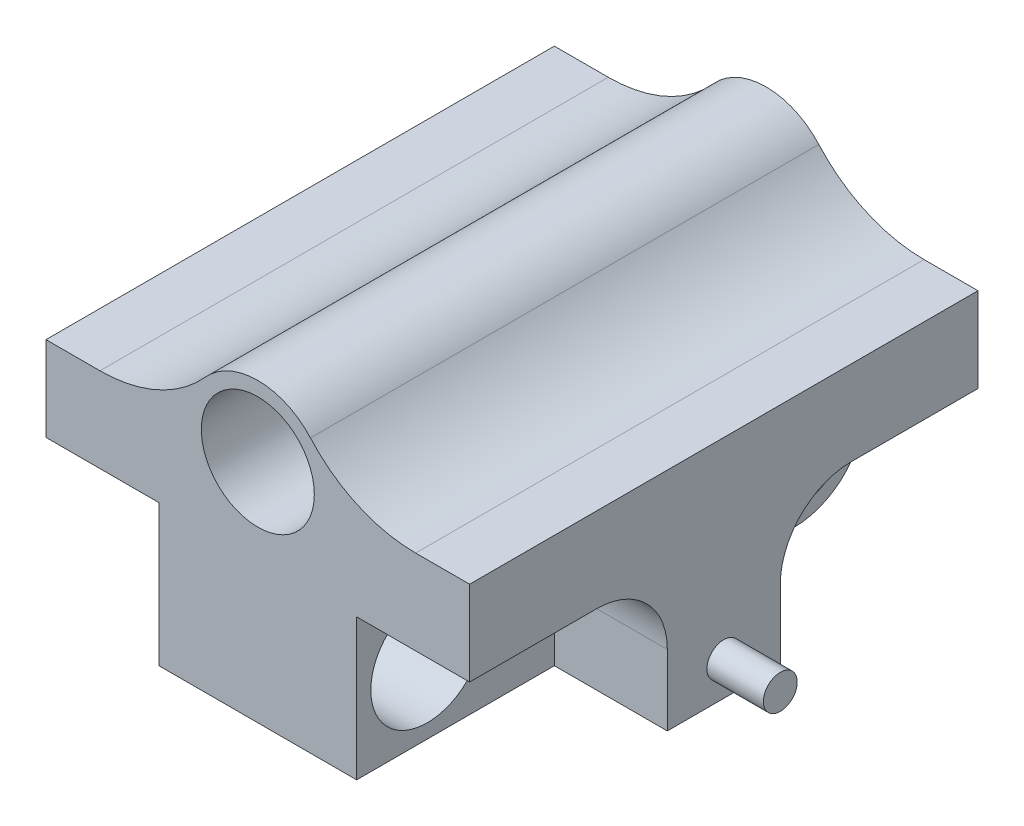
ISO-10303-21;
HEADER;
FILE_DESCRIPTION(('STEP AP214'),'2;1');
FILE_NAME('part.step','',(''),(''),'','','');
FILE_SCHEMA(('AUTOMOTIVE_DESIGN { 1 0 10303 214 1 1 1 1 }'));
ENDSEC;
DATA;
#1=APPLICATION_CONTEXT('core data for automotive mechanical design processes');
#2=APPLICATION_PROTOCOL_DEFINITION('international standard','automotive_design',2000,#1);
#3=PRODUCT_CONTEXT('',#1,'mechanical');
#4=PRODUCT('Part','Part','',(#3));
#5=PRODUCT_RELATED_PRODUCT_CATEGORY('part','',(#4));
#6=PRODUCT_DEFINITION_FORMATION('','',#4);
#7=PRODUCT_DEFINITION_CONTEXT('part definition',#1,'design');
#8=PRODUCT_DEFINITION('design','',#6,#7);
#9=PRODUCT_DEFINITION_SHAPE('','',#8);
#10=(LENGTH_UNIT() NAMED_UNIT(*) SI_UNIT(.MILLI.,.METRE.));
#11=(NAMED_UNIT(*) PLANE_ANGLE_UNIT() SI_UNIT($,.RADIAN.));
#12=(NAMED_UNIT(*) SI_UNIT($,.STERADIAN.) SOLID_ANGLE_UNIT());
#13=UNCERTAINTY_MEASURE_WITH_UNIT(LENGTH_MEASURE(1.E-05),#10,'distance_accuracy_value','');
#14=(GEOMETRIC_REPRESENTATION_CONTEXT(3) GLOBAL_UNCERTAINTY_ASSIGNED_CONTEXT((#13)) GLOBAL_UNIT_ASSIGNED_CONTEXT((#10,
#11,#12)) REPRESENTATION_CONTEXT('',''));
#15=CARTESIAN_POINT('',(0.,0.,0.));
#16=DIRECTION('',(0.,0.,1.));
#17=DIRECTION('',(1.,0.,0.));
#18=AXIS2_PLACEMENT_3D('',#15,#16,#17);
#19=CARTESIAN_POINT('',(95.0000000000002,-68.,-90.));
#20=DIRECTION('',(1.,0.,0.));
#21=DIRECTION('',(0.,0.,-1.));
#22=AXIS2_PLACEMENT_3D('',#19,#20,#21);
#23=PLANE('',#22);
#24=CARTESIAN_POINT('',(95.0000000000002,-68.,-90.));
#25=DIRECTION('',(-1.,0.,0.));
#26=DIRECTION('',(0.,-1.,0.));
#27=AXIS2_PLACEMENT_3D('',#24,#25,#26);
#28=CIRCLE('',#27,6.);
#29=CARTESIAN_POINT('',(95.0000000000002,-74.,-90.));
#30=VERTEX_POINT('',#29);
#31=EDGE_CURVE('E20',#30,#30,#28,.T.);
#32=ORIENTED_EDGE('',*,*,#31,.F.);
#33=EDGE_LOOP('',(#32));
#34=FACE_BOUND('',#33,.T.);
#35=ADVANCED_FACE('F17',(#34),#23,.T.);
#36=CARTESIAN_POINT('',(-94.9999999999999,-68.0000000000001,-90.));
#37=DIRECTION('',(1.,0.,0.));
#38=DIRECTION('',(0.,0.,-1.));
#39=AXIS2_PLACEMENT_3D('',#36,#37,#38);
#40=PLANE('',#39);
#41=CARTESIAN_POINT('',(-94.9999999999999,-68.0000000000001,-90.));
#42=DIRECTION('',(1.,0.,0.));
#43=DIRECTION('',(0.,1.,0.));
#44=AXIS2_PLACEMENT_3D('',#41,#42,#43);
#45=CIRCLE('',#44,6.);
#46=CARTESIAN_POINT('',(-94.9999999999999,-62.0000000000001,-90.));
#47=VERTEX_POINT('',#46);
#48=EDGE_CURVE('E211',#47,#47,#45,.T.);
#49=ORIENTED_EDGE('',*,*,#48,.F.);
#50=EDGE_LOOP('',(#49));
#51=FACE_BOUND('',#50,.T.);
#52=ADVANCED_FACE('F806',(#51),#40,.F.);
#53=CARTESIAN_POINT('',(-221.758641529355,-55.0000000000002,-25.));
#54=DIRECTION('',(1.,0.,0.));
#55=DIRECTION('',(0.,1.,0.));
#56=AXIS2_PLACEMENT_3D('',#53,#54,#55);
#57=CYLINDRICAL_SURFACE('',#56,20.);
#58=CARTESIAN_POINT('',(35.0000000000002,-55.,-25.));
#59=DIRECTION('',(1.,0.,0.));
#60=DIRECTION('',(0.,1.,0.));
#61=AXIS2_PLACEMENT_3D('',#58,#59,#60);
#62=CIRCLE('',#61,20.);
#63=CARTESIAN_POINT('',(35.0000000000001,-35.,-25.));
#64=VERTEX_POINT('',#63);
#65=EDGE_CURVE('E256',#64,#64,#62,.F.);
#66=ORIENTED_EDGE('',*,*,#65,.F.);
#67=EDGE_LOOP('',(#66));
#68=FACE_BOUND('',#67,.T.);
#69=CARTESIAN_POINT('',(-35.0000000000002,-55.0000000000001,-25.));
#70=DIRECTION('',(1.,0.,0.));
#71=DIRECTION('',(0.,1.,0.));
#72=AXIS2_PLACEMENT_3D('',#69,#70,#71);
#73=CIRCLE('',#72,20.);
#74=CARTESIAN_POINT('',(-35.0000000000002,-35.0000000000001,-25.));
#75=VERTEX_POINT('',#74);
#76=EDGE_CURVE('E204',#75,#75,#73,.F.);
#77=ORIENTED_EDGE('',*,*,#76,.T.);
#78=EDGE_LOOP('',(#77));
#79=FACE_BOUND('',#78,.T.);
#80=ADVANCED_FACE('F798',(#68,#79),#57,.F.);
#81=CARTESIAN_POINT('',(-221.758641529355,-55.0000000000002,-155.));
#82=DIRECTION('',(-1.,0.,0.));
#83=DIRECTION('',(0.,-1.,0.));
#84=AXIS2_PLACEMENT_3D('',#81,#82,#83);
#85=CYLINDRICAL_SURFACE('',#84,20.);
#86=CARTESIAN_POINT('',(35.0000000000002,-55.,-155.));
#87=DIRECTION('',(-1.,0.,0.));
#88=DIRECTION('',(0.,-1.,0.));
#89=AXIS2_PLACEMENT_3D('',#86,#87,#88);
#90=CIRCLE('',#89,20.);
#91=CARTESIAN_POINT('',(35.0000000000002,-75.,-155.));
#92=VERTEX_POINT('',#91);
#93=EDGE_CURVE('E251',#92,#92,#90,.F.);
#94=ORIENTED_EDGE('',*,*,#93,.T.);
#95=EDGE_LOOP('',(#94));
#96=FACE_BOUND('',#95,.T.);
#97=CARTESIAN_POINT('',(-35.0000000000002,-55.0000000000001,-155.));
#98=DIRECTION('',(-1.,0.,0.));
#99=DIRECTION('',(0.,-1.,0.));
#100=AXIS2_PLACEMENT_3D('',#97,#98,#99);
#101=CIRCLE('',#100,20.);
#102=CARTESIAN_POINT('',(-35.0000000000002,-75.0000000000001,-155.));
#103=VERTEX_POINT('',#102);
#104=EDGE_CURVE('E319',#103,#103,#101,.F.);
#105=ORIENTED_EDGE('',*,*,#104,.F.);
#106=EDGE_LOOP('',(#105));
#107=FACE_BOUND('',#106,.T.);
#108=ADVANCED_FACE('F791',(#96,#107),#85,.F.);
#109=CARTESIAN_POINT('',(75.0000000000002,-55.,-45.));
#110=DIRECTION('',(-1.,0.,0.));
#111=DIRECTION('',(0.,-1.,0.));
#112=AXIS2_PLACEMENT_3D('',#109,#110,#111);
#113=CYLINDRICAL_SURFACE('',#112,25.);
#114=DIRECTION('',(1.,0.,0.));
#115=VECTOR('',#114,1.);
#116=CARTESIAN_POINT('',(75.0000000000001,-30.,-45.));
#117=LINE('',#116,#115);
#118=CARTESIAN_POINT('',(75.0000000000001,-30.,-45.));
#119=VERTEX_POINT('',#118);
#120=CARTESIAN_POINT('',(35.0000000000001,-30.,-45.));
#121=VERTEX_POINT('',#120);
#122=EDGE_CURVE('E252',#119,#121,#117,.F.);
#123=ORIENTED_EDGE('',*,*,#122,.T.);
#124=CARTESIAN_POINT('',(35.0000000000001,-55.,-45.));
#125=DIRECTION('',(-1.,0.,0.));
#126=DIRECTION('',(0.,-1.,0.));
#127=AXIS2_PLACEMENT_3D('',#124,#125,#126);
#128=CIRCLE('',#127,25.);
#129=CARTESIAN_POINT('',(35.0000000000002,-55.,-70.));
#130=VERTEX_POINT('',#129);
#131=EDGE_CURVE('E326',#130,#121,#128,.F.);
#132=ORIENTED_EDGE('',*,*,#131,.F.);
#133=DIRECTION('',(-1.,0.,0.));
#134=VECTOR('',#133,1.);
#135=CARTESIAN_POINT('',(75.0000000000002,-55.,-70.));
#136=LINE('',#135,#134);
#137=CARTESIAN_POINT('',(75.0000000000002,-55.,-70.));
#138=VERTEX_POINT('',#137);
#139=EDGE_CURVE('E222',#130,#138,#136,.F.);
#140=ORIENTED_EDGE('',*,*,#139,.T.);
#141=CARTESIAN_POINT('',(75.0000000000002,-55.,-45.));
#142=DIRECTION('',(-1.,0.,0.));
#143=DIRECTION('',(0.,-1.,0.));
#144=AXIS2_PLACEMENT_3D('',#141,#142,#143);
#145=CIRCLE('',#144,25.);
#146=EDGE_CURVE('E305',#138,#119,#145,.F.);
#147=ORIENTED_EDGE('',*,*,#146,.T.);
#148=EDGE_LOOP('',(#123,#132,#140,#147));
#149=FACE_BOUND('',#148,.T.);
#150=ADVANCED_FACE('F561',(#149),#113,.F.);
#151=CARTESIAN_POINT('',(75.0000000000002,-55.,-135.));
#152=DIRECTION('',(1.,0.,0.));
#153=DIRECTION('',(0.,1.,0.));
#154=AXIS2_PLACEMENT_3D('',#151,#152,#153);
#155=CYLINDRICAL_SURFACE('',#154,25.);
#156=DIRECTION('',(-1.,0.,0.));
#157=VECTOR('',#156,1.);
#158=CARTESIAN_POINT('',(75.0000000000002,-55.,-110.));
#159=LINE('',#158,#157);
#160=CARTESIAN_POINT('',(35.0000000000002,-55.,-110.));
#161=VERTEX_POINT('',#160);
#162=CARTESIAN_POINT('',(75.0000000000002,-55.,-110.));
#163=VERTEX_POINT('',#162);
#164=EDGE_CURVE('E229',#161,#163,#159,.F.);
#165=ORIENTED_EDGE('',*,*,#164,.F.);
#166=CARTESIAN_POINT('',(35.0000000000002,-55.,-135.));
#167=DIRECTION('',(1.,0.,0.));
#168=DIRECTION('',(0.,1.,0.));
#169=AXIS2_PLACEMENT_3D('',#166,#167,#168);
#170=CIRCLE('',#169,25.);
#171=CARTESIAN_POINT('',(35.0000000000001,-30.,-135.));
#172=VERTEX_POINT('',#171);
#173=EDGE_CURVE('E314',#161,#172,#170,.F.);
#174=ORIENTED_EDGE('',*,*,#173,.T.);
#175=DIRECTION('',(1.,0.,0.));
#176=VECTOR('',#175,1.);
#177=CARTESIAN_POINT('',(75.0000000000001,-30.,-135.));
#178=LINE('',#177,#176);
#179=CARTESIAN_POINT('',(75.0000000000001,-30.,-135.));
#180=VERTEX_POINT('',#179);
#181=EDGE_CURVE('E248',#180,#172,#178,.F.);
#182=ORIENTED_EDGE('',*,*,#181,.F.);
#183=CARTESIAN_POINT('',(75.0000000000002,-55.,-135.));
#184=DIRECTION('',(1.,0.,0.));
#185=DIRECTION('',(0.,1.,0.));
#186=AXIS2_PLACEMENT_3D('',#183,#184,#185);
#187=CIRCLE('',#186,25.);
#188=EDGE_CURVE('E301',#180,#163,#187,.T.);
#189=ORIENTED_EDGE('',*,*,#188,.T.);
#190=EDGE_LOOP('',(#165,#174,#182,#189));
#191=FACE_BOUND('',#190,.T.);
#192=ADVANCED_FACE('F572',(#191),#155,.F.);
#193=CARTESIAN_POINT('',(75.0000000000002,-55.,-110.));
#194=DIRECTION('',(0.,0.,-1.));
#195=DIRECTION('',(-1.,0.,0.));
#196=AXIS2_PLACEMENT_3D('',#193,#194,#195);
#197=PLANE('',#196);
#198=DIRECTION('',(0.,1.,0.));
#199=VECTOR('',#198,1.);
#200=CARTESIAN_POINT('',(35.0000000000002,-57.1359971060513,-110.));
#201=LINE('',#200,#199);
#202=CARTESIAN_POINT('',(35.0000000000002,-80.,-110.));
#203=VERTEX_POINT('',#202);
#204=EDGE_CURVE('E317',#203,#161,#201,.T.);
#205=ORIENTED_EDGE('',*,*,#204,.T.);
#206=ORIENTED_EDGE('',*,*,#164,.T.);
#207=DIRECTION('',(0.,1.,0.));
#208=VECTOR('',#207,1.);
#209=CARTESIAN_POINT('',(75.0000000000001,0.,-110.));
#210=LINE('',#209,#208);
#211=CARTESIAN_POINT('',(75.0000000000001,-80.,-110.));
#212=VERTEX_POINT('',#211);
#213=EDGE_CURVE('E234',#163,#212,#210,.F.);
#214=ORIENTED_EDGE('',*,*,#213,.T.);
#215=DIRECTION('',(1.,0.,0.));
#216=VECTOR('',#215,1.);
#217=CARTESIAN_POINT('',(75.0000000000002,-80.,-110.));
#218=LINE('',#217,#216);
#219=EDGE_CURVE('E239',#212,#203,#218,.F.);
#220=ORIENTED_EDGE('',*,*,#219,.T.);
#221=EDGE_LOOP('',(#205,#206,#214,#220));
#222=FACE_BOUND('',#221,.T.);
#223=ADVANCED_FACE('F566',(#222),#197,.T.);
#224=CARTESIAN_POINT('',(75.0000000000002,-55.,-70.));
#225=DIRECTION('',(0.,0.,-1.));
#226=DIRECTION('',(-1.,0.,0.));
#227=AXIS2_PLACEMENT_3D('',#224,#225,#226);
#228=PLANE('',#227);
#229=ORIENTED_EDGE('',*,*,#139,.F.);
#230=DIRECTION('',(0.,1.,0.));
#231=VECTOR('',#230,1.);
#232=CARTESIAN_POINT('',(35.0000000000002,-57.1359971060513,-70.));
#233=LINE('',#232,#231);
#234=CARTESIAN_POINT('',(35.0000000000002,-80.,-70.));
#235=VERTEX_POINT('',#234);
#236=EDGE_CURVE('E327',#235,#130,#233,.T.);
#237=ORIENTED_EDGE('',*,*,#236,.F.);
#238=DIRECTION('',(1.,0.,0.));
#239=VECTOR('',#238,1.);
#240=CARTESIAN_POINT('',(75.0000000000002,-80.,-70.));
#241=LINE('',#240,#239);
#242=CARTESIAN_POINT('',(75.0000000000001,-80.,-70.));
#243=VERTEX_POINT('',#242);
#244=EDGE_CURVE('E237',#235,#243,#241,.T.);
#245=ORIENTED_EDGE('',*,*,#244,.T.);
#246=DIRECTION('',(0.,1.,0.));
#247=VECTOR('',#246,1.);
#248=CARTESIAN_POINT('',(75.0000000000001,0.,-70.));
#249=LINE('',#248,#247);
#250=EDGE_CURVE('E233',#243,#138,#249,.T.);
#251=ORIENTED_EDGE('',*,*,#250,.T.);
#252=EDGE_LOOP('',(#229,#237,#245,#251));
#253=FACE_BOUND('',#252,.T.);
#254=ADVANCED_FACE('F558',(#253),#228,.F.);
#255=CARTESIAN_POINT('',(75.0000000000002,-68.,-90.));
#256=DIRECTION('',(-1.,0.,0.));
#257=DIRECTION('',(0.,-1.,0.));
#258=AXIS2_PLACEMENT_3D('',#255,#256,#257);
#259=CYLINDRICAL_SURFACE('',#258,6.);
#260=CARTESIAN_POINT('',(75.0000000000002,-68.,-90.));
#261=DIRECTION('',(-1.,0.,0.));
#262=DIRECTION('',(0.,-1.,0.));
#263=AXIS2_PLACEMENT_3D('',#260,#261,#262);
#264=CIRCLE('',#263,6.);
#265=CARTESIAN_POINT('',(75.0000000000002,-74.,-90.));
#266=VERTEX_POINT('',#265);
#267=EDGE_CURVE('E297',#266,#266,#264,.F.);
#268=ORIENTED_EDGE('',*,*,#267,.T.);
#269=EDGE_LOOP('',(#268));
#270=FACE_BOUND('',#269,.T.);
#271=ORIENTED_EDGE('',*,*,#31,.T.);
#272=EDGE_LOOP('',(#271));
#273=FACE_BOUND('',#272,.T.);
#274=ADVANCED_FACE('F759',(#270,#273),#259,.T.);
#275=CARTESIAN_POINT('',(-75.0000000000002,-55.,-45.));
#276=DIRECTION('',(-1.,0.,0.));
#277=DIRECTION('',(0.,-1.,0.));
#278=AXIS2_PLACEMENT_3D('',#275,#276,#277);
#279=CYLINDRICAL_SURFACE('',#278,25.);
#280=DIRECTION('',(1.,0.,0.));
#281=VECTOR('',#280,1.);
#282=CARTESIAN_POINT('',(-75.0000000000002,-55.,-70.));
#283=LINE('',#282,#281);
#284=CARTESIAN_POINT('',(-35.0000000000002,-55.,-70.));
#285=VERTEX_POINT('',#284);
#286=CARTESIAN_POINT('',(-75.,-55.,-70.));
#287=VERTEX_POINT('',#286);
#288=EDGE_CURVE('E181',#285,#287,#283,.F.);
#289=ORIENTED_EDGE('',*,*,#288,.F.);
#290=CARTESIAN_POINT('',(-35.0000000000002,-55.,-45.));
#291=DIRECTION('',(-1.,0.,0.));
#292=DIRECTION('',(0.,-1.,0.));
#293=AXIS2_PLACEMENT_3D('',#290,#291,#292);
#294=CIRCLE('',#293,25.);
#295=CARTESIAN_POINT('',(-35.0000000000002,-30.,-45.));
#296=VERTEX_POINT('',#295);
#297=EDGE_CURVE('E200',#285,#296,#294,.F.);
#298=ORIENTED_EDGE('',*,*,#297,.T.);
#299=DIRECTION('',(1.,0.,0.));
#300=VECTOR('',#299,1.);
#301=CARTESIAN_POINT('',(-75.0000000000001,-30.,-45.));
#302=LINE('',#301,#300);
#303=CARTESIAN_POINT('',(-75.,-30.,-45.));
#304=VERTEX_POINT('',#303);
#305=EDGE_CURVE('E188',#304,#296,#302,.T.);
#306=ORIENTED_EDGE('',*,*,#305,.F.);
#307=CARTESIAN_POINT('',(-75.0000000000002,-55.,-45.));
#308=DIRECTION('',(-1.,0.,0.));
#309=DIRECTION('',(0.,-1.,0.));
#310=AXIS2_PLACEMENT_3D('',#307,#308,#309);
#311=CIRCLE('',#310,25.);
#312=EDGE_CURVE('E293',#304,#287,#311,.T.);
#313=ORIENTED_EDGE('',*,*,#312,.T.);
#314=EDGE_LOOP('',(#289,#298,#306,#313));
#315=FACE_BOUND('',#314,.T.);
#316=ADVANCED_FACE('F206',(#315),#279,.F.);
#317=CARTESIAN_POINT('',(-75.0000000000002,-55.,-70.));
#318=DIRECTION('',(0.,0.,1.));
#319=DIRECTION('',(1.,0.,0.));
#320=AXIS2_PLACEMENT_3D('',#317,#318,#319);
#321=PLANE('',#320);
#322=DIRECTION('',(0.,1.,0.));
#323=VECTOR('',#322,1.);
#324=CARTESIAN_POINT('',(-35.0000000000002,-57.1359971060513,-70.));
#325=LINE('',#324,#323);
#326=CARTESIAN_POINT('',(-35.0000000000002,-80.,-70.));
#327=VERTEX_POINT('',#326);
#328=EDGE_CURVE('E195',#327,#285,#325,.T.);
#329=ORIENTED_EDGE('',*,*,#328,.T.);
#330=ORIENTED_EDGE('',*,*,#288,.T.);
#331=DIRECTION('',(0.,1.,0.));
#332=VECTOR('',#331,1.);
#333=CARTESIAN_POINT('',(-74.9999999999998,-80.,-70.));
#334=LINE('',#333,#332);
#335=CARTESIAN_POINT('',(-74.9999999999998,-80.,-70.));
#336=VERTEX_POINT('',#335);
#337=EDGE_CURVE('E295',#287,#336,#334,.F.);
#338=ORIENTED_EDGE('',*,*,#337,.T.);
#339=DIRECTION('',(1.,0.,0.));
#340=VECTOR('',#339,1.);
#341=CARTESIAN_POINT('',(75.0000000000002,-80.,-70.));
#342=LINE('',#341,#340);
#343=EDGE_CURVE('E337',#336,#327,#342,.T.);
#344=ORIENTED_EDGE('',*,*,#343,.T.);
#345=EDGE_LOOP('',(#329,#330,#338,#344));
#346=FACE_BOUND('',#345,.T.);
#347=ADVANCED_FACE('F380',(#346),#321,.T.);
#348=CARTESIAN_POINT('',(-75.0000000000002,-55.,-110.));
#349=DIRECTION('',(0.,0.,1.));
#350=DIRECTION('',(1.,0.,0.));
#351=AXIS2_PLACEMENT_3D('',#348,#349,#350);
#352=PLANE('',#351);
#353=DIRECTION('',(1.,0.,0.));
#354=VECTOR('',#353,1.);
#355=CARTESIAN_POINT('',(-75.0000000000002,-55.,-110.));
#356=LINE('',#355,#354);
#357=CARTESIAN_POINT('',(-75.,-55.,-110.));
#358=VERTEX_POINT('',#357);
#359=CARTESIAN_POINT('',(-35.0000000000001,-55.,-110.));
#360=VERTEX_POINT('',#359);
#361=EDGE_CURVE('E196',#358,#360,#356,.T.);
#362=ORIENTED_EDGE('',*,*,#361,.T.);
#363=DIRECTION('',(0.,1.,0.));
#364=VECTOR('',#363,1.);
#365=CARTESIAN_POINT('',(-35.0000000000002,-57.1359971060513,-110.));
#366=LINE('',#365,#364);
#367=CARTESIAN_POINT('',(-35.0000000000002,-80.,-110.));
#368=VERTEX_POINT('',#367);
#369=EDGE_CURVE('E324',#368,#360,#366,.T.);
#370=ORIENTED_EDGE('',*,*,#369,.F.);
#371=DIRECTION('',(1.,0.,0.));
#372=VECTOR('',#371,1.);
#373=CARTESIAN_POINT('',(75.0000000000002,-80.,-110.));
#374=LINE('',#373,#372);
#375=CARTESIAN_POINT('',(-75.,-80.,-110.));
#376=VERTEX_POINT('',#375);
#377=EDGE_CURVE('E244',#368,#376,#374,.F.);
#378=ORIENTED_EDGE('',*,*,#377,.T.);
#379=DIRECTION('',(0.,1.,0.));
#380=VECTOR('',#379,1.);
#381=CARTESIAN_POINT('',(-74.9999999999998,-80.,-110.));
#382=LINE('',#381,#380);
#383=EDGE_CURVE('E292',#376,#358,#382,.T.);
#384=ORIENTED_EDGE('',*,*,#383,.T.);
#385=EDGE_LOOP('',(#362,#370,#378,#384));
#386=FACE_BOUND('',#385,.T.);
#387=ADVANCED_FACE('F739',(#386),#352,.F.);
#388=CARTESIAN_POINT('',(-74.9999999999999,-68.,-90.));
#389=DIRECTION('',(1.,0.,0.));
#390=DIRECTION('',(0.,1.,0.));
#391=AXIS2_PLACEMENT_3D('',#388,#389,#390);
#392=CYLINDRICAL_SURFACE('',#391,6.);
#393=CARTESIAN_POINT('',(-74.9999999999999,-68.,-90.));
#394=DIRECTION('',(1.,0.,0.));
#395=DIRECTION('',(0.,1.,0.));
#396=AXIS2_PLACEMENT_3D('',#393,#394,#395);
#397=CIRCLE('',#396,6.);
#398=CARTESIAN_POINT('',(-74.9999999999999,-62.,-90.));
#399=VERTEX_POINT('',#398);
#400=EDGE_CURVE('E284',#399,#399,#397,.F.);
#401=ORIENTED_EDGE('',*,*,#400,.T.);
#402=EDGE_LOOP('',(#401));
#403=FACE_BOUND('',#402,.T.);
#404=ORIENTED_EDGE('',*,*,#48,.T.);
#405=EDGE_LOOP('',(#404));
#406=FACE_BOUND('',#405,.T.);
#407=ADVANCED_FACE('F731',(#403,#406),#392,.T.);
#408=CARTESIAN_POINT('',(-75.0000000000002,-55.,-135.));
#409=DIRECTION('',(1.,0.,0.));
#410=DIRECTION('',(0.,1.,0.));
#411=AXIS2_PLACEMENT_3D('',#408,#409,#410);
#412=CYLINDRICAL_SURFACE('',#411,25.);
#413=DIRECTION('',(1.,0.,0.));
#414=VECTOR('',#413,1.);
#415=CARTESIAN_POINT('',(-75.0000000000001,-30.,-135.));
#416=LINE('',#415,#414);
#417=CARTESIAN_POINT('',(-75.0000000000001,-30.,-135.));
#418=VERTEX_POINT('',#417);
#419=CARTESIAN_POINT('',(-35.0000000000001,-30.,-135.));
#420=VERTEX_POINT('',#419);
#421=EDGE_CURVE('E287',#418,#420,#416,.T.);
#422=ORIENTED_EDGE('',*,*,#421,.T.);
#423=CARTESIAN_POINT('',(-35.0000000000001,-55.,-135.));
#424=DIRECTION('',(1.,0.,0.));
#425=DIRECTION('',(0.,1.,0.));
#426=AXIS2_PLACEMENT_3D('',#423,#424,#425);
#427=CIRCLE('',#426,25.);
#428=EDGE_CURVE('E322',#360,#420,#427,.F.);
#429=ORIENTED_EDGE('',*,*,#428,.F.);
#430=ORIENTED_EDGE('',*,*,#361,.F.);
#431=CARTESIAN_POINT('',(-75.0000000000002,-55.,-135.));
#432=DIRECTION('',(1.,0.,0.));
#433=DIRECTION('',(0.,1.,0.));
#434=AXIS2_PLACEMENT_3D('',#431,#432,#433);
#435=CIRCLE('',#434,25.);
#436=EDGE_CURVE('E288',#358,#418,#435,.F.);
#437=ORIENTED_EDGE('',*,*,#436,.T.);
#438=EDGE_LOOP('',(#422,#429,#430,#437));
#439=FACE_BOUND('',#438,.T.);
#440=ADVANCED_FACE('F724',(#439),#412,.F.);
#441=CARTESIAN_POINT('',(-75.0000000000001,-30.,0.));
#442=DIRECTION('',(0.,-1.,0.));
#443=DIRECTION('',(0.,0.,-1.));
#444=AXIS2_PLACEMENT_3D('',#441,#442,#443);
#445=PLANE('',#444);
#446=DIRECTION('',(0.,0.,-1.));
#447=VECTOR('',#446,1.);
#448=CARTESIAN_POINT('',(-35.0000000000002,-30.,-31.9276920603419));
#449=LINE('',#448,#447);
#450=CARTESIAN_POINT('',(-35.0000000000001,-30.,0.));
#451=VERTEX_POINT('',#450);
#452=EDGE_CURVE('E192',#296,#451,#449,.F.);
#453=ORIENTED_EDGE('',*,*,#452,.T.);
#454=DIRECTION('',(1.,0.,0.));
#455=VECTOR('',#454,1.);
#456=CARTESIAN_POINT('',(0.,-30.,0.));
#457=LINE('',#456,#455);
#458=CARTESIAN_POINT('',(-75.,-30.,0.));
#459=VERTEX_POINT('',#458);
#460=EDGE_CURVE('E356',#459,#451,#457,.T.);
#461=ORIENTED_EDGE('',*,*,#460,.F.);
#462=DIRECTION('',(0.,0.,-1.));
#463=VECTOR('',#462,1.);
#464=CARTESIAN_POINT('',(-74.9999999999998,-30.,-180.));
#465=LINE('',#464,#463);
#466=EDGE_CURVE('E194',#459,#304,#465,.T.);
#467=ORIENTED_EDGE('',*,*,#466,.T.);
#468=ORIENTED_EDGE('',*,*,#305,.T.);
#469=EDGE_LOOP('',(#453,#461,#467,#468));
#470=FACE_BOUND('',#469,.T.);
#471=ADVANCED_FACE('F190',(#470),#445,.T.);
#472=CARTESIAN_POINT('',(-35.0000000000002,-57.1359971060513,-31.9276920603419));
#473=DIRECTION('',(1.,0.,0.));
#474=DIRECTION('',(0.,0.,-1.));
#475=AXIS2_PLACEMENT_3D('',#472,#473,#474);
#476=PLANE('',#475);
#477=ORIENTED_EDGE('',*,*,#76,.F.);
#478=EDGE_LOOP('',(#477));
#479=FACE_BOUND('',#478,.T.);
#480=DIRECTION('',(0.,1.,0.));
#481=VECTOR('',#480,1.);
#482=CARTESIAN_POINT('',(-35.0000000000001,0.,0.));
#483=LINE('',#482,#481);
#484=CARTESIAN_POINT('',(-35.0000000000001,-80.,0.));
#485=VERTEX_POINT('',#484);
#486=EDGE_CURVE('E203',#451,#485,#483,.F.);
#487=ORIENTED_EDGE('',*,*,#486,.F.);
#488=ORIENTED_EDGE('',*,*,#452,.F.);
#489=ORIENTED_EDGE('',*,*,#297,.F.);
#490=ORIENTED_EDGE('',*,*,#328,.F.);
#491=DIRECTION('',(0.,0.,1.));
#492=VECTOR('',#491,1.);
#493=CARTESIAN_POINT('',(-35.0000000000002,-80.,-180.));
#494=LINE('',#493,#492);
#495=EDGE_CURVE('E240',#327,#485,#494,.T.);
#496=ORIENTED_EDGE('',*,*,#495,.T.);
#497=EDGE_LOOP('',(#487,#488,#489,#490,#496));
#498=FACE_BOUND('',#497,.T.);
#499=ADVANCED_FACE('F199',(#479,#498),#476,.F.);
#500=CARTESIAN_POINT('',(75.0000000000002,-80.,-180.));
#501=DIRECTION('',(0.,1.,0.));
#502=DIRECTION('',(0.,0.,1.));
#503=AXIS2_PLACEMENT_3D('',#500,#501,#502);
#504=PLANE('',#503);
#505=DIRECTION('',(0.,0.,-1.));
#506=VECTOR('',#505,1.);
#507=CARTESIAN_POINT('',(-74.9999999999998,-80.,-180.));
#508=LINE('',#507,#506);
#509=EDGE_CURVE('E372',#336,#376,#508,.T.);
#510=ORIENTED_EDGE('',*,*,#509,.T.);
#511=ORIENTED_EDGE('',*,*,#377,.F.);
#512=DIRECTION('',(0.,0.,1.));
#513=VECTOR('',#512,1.);
#514=CARTESIAN_POINT('',(-35.0000000000002,-80.,-148.072307939658));
#515=LINE('',#514,#513);
#516=CARTESIAN_POINT('',(-35.0000000000002,-80.,-155.));
#517=VERTEX_POINT('',#516);
#518=EDGE_CURVE('E478',#517,#368,#515,.T.);
#519=ORIENTED_EDGE('',*,*,#518,.F.);
#520=DIRECTION('',(1.,0.,0.));
#521=VECTOR('',#520,1.);
#522=CARTESIAN_POINT('',(37.5000000000001,-80.,-155.));
#523=LINE('',#522,#521);
#524=CARTESIAN_POINT('',(35.0000000000002,-80.,-155.));
#525=VERTEX_POINT('',#524);
#526=EDGE_CURVE('E257',#525,#517,#523,.F.);
#527=ORIENTED_EDGE('',*,*,#526,.F.);
#528=DIRECTION('',(0.,0.,1.));
#529=VECTOR('',#528,1.);
#530=CARTESIAN_POINT('',(35.0000000000002,-80.,-148.072307939658));
#531=LINE('',#530,#529);
#532=EDGE_CURVE('E259',#525,#203,#531,.T.);
#533=ORIENTED_EDGE('',*,*,#532,.T.);
#534=ORIENTED_EDGE('',*,*,#219,.F.);
#535=DIRECTION('',(0.,0.,1.));
#536=VECTOR('',#535,1.);
#537=CARTESIAN_POINT('',(75.0000000000001,-80.,-180.));
#538=LINE('',#537,#536);
#539=EDGE_CURVE('E230',#212,#243,#538,.T.);
#540=ORIENTED_EDGE('',*,*,#539,.T.);
#541=ORIENTED_EDGE('',*,*,#244,.F.);
#542=DIRECTION('',(0.,0.,-1.));
#543=VECTOR('',#542,1.);
#544=CARTESIAN_POINT('',(35.0000000000002,-80.,-31.9276920603419));
#545=LINE('',#544,#543);
#546=CARTESIAN_POINT('',(35.0000000000002,-80.,0.));
#547=VERTEX_POINT('',#546);
#548=EDGE_CURVE('E333',#547,#235,#545,.T.);
#549=ORIENTED_EDGE('',*,*,#548,.F.);
#550=DIRECTION('',(1.,0.,0.));
#551=VECTOR('',#550,1.);
#552=CARTESIAN_POINT('',(0.,-80.,0.));
#553=LINE('',#552,#551);
#554=EDGE_CURVE('E347',#485,#547,#553,.T.);
#555=ORIENTED_EDGE('',*,*,#554,.F.);
#556=ORIENTED_EDGE('',*,*,#495,.F.);
#557=ORIENTED_EDGE('',*,*,#343,.F.);
#558=EDGE_LOOP('',(#510,#511,#519,#527,#533,#534,#540,#541,#549,#555,#556,#557));
#559=FACE_BOUND('',#558,.T.);
#560=ADVANCED_FACE('F384',(#559),#504,.F.);
#561=CARTESIAN_POINT('',(35.0000000000002,-57.1359971060513,-31.9276920603419));
#562=DIRECTION('',(1.,0.,0.));
#563=DIRECTION('',(0.,0.,-1.));
#564=AXIS2_PLACEMENT_3D('',#561,#562,#563);
#565=PLANE('',#564);
#566=ORIENTED_EDGE('',*,*,#65,.T.);
#567=EDGE_LOOP('',(#566));
#568=FACE_BOUND('',#567,.T.);
#569=DIRECTION('',(0.,0.,1.));
#570=VECTOR('',#569,1.);
#571=CARTESIAN_POINT('',(35.0000000000001,-30.,0.));
#572=LINE('',#571,#570);
#573=CARTESIAN_POINT('',(35.0000000000002,-30.,0.));
#574=VERTEX_POINT('',#573);
#575=EDGE_CURVE('E255',#121,#574,#572,.T.);
#576=ORIENTED_EDGE('',*,*,#575,.T.);
#577=DIRECTION('',(0.,1.,0.));
#578=VECTOR('',#577,1.);
#579=CARTESIAN_POINT('',(35.0000000000002,0.,0.));
#580=LINE('',#579,#578);
#581=EDGE_CURVE('E349',#547,#574,#580,.T.);
#582=ORIENTED_EDGE('',*,*,#581,.F.);
#583=ORIENTED_EDGE('',*,*,#548,.T.);
#584=ORIENTED_EDGE('',*,*,#236,.T.);
#585=ORIENTED_EDGE('',*,*,#131,.T.);
#586=EDGE_LOOP('',(#576,#582,#583,#584,#585));
#587=FACE_BOUND('',#586,.T.);
#588=ADVANCED_FACE('F511',(#568,#587),#565,.T.);
#589=CARTESIAN_POINT('',(75.0000000000001,-30.,0.));
#590=DIRECTION('',(0.,1.,0.));
#591=DIRECTION('',(0.,0.,1.));
#592=AXIS2_PLACEMENT_3D('',#589,#590,#591);
#593=PLANE('',#592);
#594=DIRECTION('',(1.,0.,0.));
#595=VECTOR('',#594,1.);
#596=CARTESIAN_POINT('',(0.,-30.,0.));
#597=LINE('',#596,#595);
#598=CARTESIAN_POINT('',(75.0000000000001,-30.,0.));
#599=VERTEX_POINT('',#598);
#600=EDGE_CURVE('E498',#574,#599,#597,.T.);
#601=ORIENTED_EDGE('',*,*,#600,.F.);
#602=ORIENTED_EDGE('',*,*,#575,.F.);
#603=ORIENTED_EDGE('',*,*,#122,.F.);
#604=DIRECTION('',(0.,0.,1.));
#605=VECTOR('',#604,1.);
#606=CARTESIAN_POINT('',(75.0000000000001,-30.,-180.));
#607=LINE('',#606,#605);
#608=EDGE_CURVE('E308',#119,#599,#607,.T.);
#609=ORIENTED_EDGE('',*,*,#608,.T.);
#610=EDGE_LOOP('',(#601,#602,#603,#609));
#611=FACE_BOUND('',#610,.T.);
#612=ADVANCED_FACE('F513',(#611),#593,.F.);
#613=CARTESIAN_POINT('',(-35.0000000000002,-57.1359971060513,-148.072307939658));
#614=DIRECTION('',(-1.,0.,0.));
#615=DIRECTION('',(0.,0.,1.));
#616=AXIS2_PLACEMENT_3D('',#613,#614,#615);
#617=PLANE('',#616);
#618=ORIENTED_EDGE('',*,*,#104,.T.);
#619=EDGE_LOOP('',(#618));
#620=FACE_BOUND('',#619,.T.);
#621=DIRECTION('',(0.,0.,1.));
#622=VECTOR('',#621,1.);
#623=CARTESIAN_POINT('',(-35.0000000000001,-30.,-180.));
#624=LINE('',#623,#622);
#625=CARTESIAN_POINT('',(-35.0000000000001,-30.,-180.));
#626=VERTEX_POINT('',#625);
#627=EDGE_CURVE('E368',#420,#626,#624,.F.);
#628=ORIENTED_EDGE('',*,*,#627,.T.);
#629=DIRECTION('',(0.,1.,0.));
#630=VECTOR('',#629,1.);
#631=CARTESIAN_POINT('',(-35.0000000000001,0.,-180.));
#632=LINE('',#631,#630);
#633=CARTESIAN_POINT('',(-35.0000000000002,-55.,-180.));
#634=VERTEX_POINT('',#633);
#635=EDGE_CURVE('E471',#626,#634,#632,.F.);
#636=ORIENTED_EDGE('',*,*,#635,.T.);
#637=CARTESIAN_POINT('',(-35.0000000000002,-55.,-155.));
#638=DIRECTION('',(1.,0.,0.));
#639=DIRECTION('',(0.,1.,0.));
#640=AXIS2_PLACEMENT_3D('',#637,#638,#639);
#641=CIRCLE('',#640,25.);
#642=EDGE_CURVE('E260',#517,#634,#641,.T.);
#643=ORIENTED_EDGE('',*,*,#642,.F.);
#644=ORIENTED_EDGE('',*,*,#518,.T.);
#645=ORIENTED_EDGE('',*,*,#369,.T.);
#646=ORIENTED_EDGE('',*,*,#428,.T.);
#647=EDGE_LOOP('',(#628,#636,#643,#644,#645,#646));
#648=FACE_BOUND('',#647,.T.);
#649=ADVANCED_FACE('F584',(#620,#648),#617,.T.);
#650=CARTESIAN_POINT('',(37.5000000000001,-55.,-155.));
#651=DIRECTION('',(1.,0.,0.));
#652=DIRECTION('',(0.,1.,0.));
#653=AXIS2_PLACEMENT_3D('',#650,#651,#652);
#654=CYLINDRICAL_SURFACE('',#653,25.);
#655=CARTESIAN_POINT('',(35.0000000000002,-55.,-155.));
#656=DIRECTION('',(1.,0.,0.));
#657=DIRECTION('',(0.,1.,0.));
#658=AXIS2_PLACEMENT_3D('',#655,#656,#657);
#659=CIRCLE('',#658,25.);
#660=CARTESIAN_POINT('',(35.0000000000002,-55.,-180.));
#661=VERTEX_POINT('',#660);
#662=EDGE_CURVE('E311',#661,#525,#659,.F.);
#663=ORIENTED_EDGE('',*,*,#662,.T.);
#664=ORIENTED_EDGE('',*,*,#526,.T.);
#665=ORIENTED_EDGE('',*,*,#642,.T.);
#666=DIRECTION('',(1.,0.,0.));
#667=VECTOR('',#666,1.);
#668=CARTESIAN_POINT('',(0.,-55.,-180.));
#669=LINE('',#668,#667);
#670=EDGE_CURVE('E458',#634,#661,#669,.T.);
#671=ORIENTED_EDGE('',*,*,#670,.T.);
#672=EDGE_LOOP('',(#663,#664,#665,#671));
#673=FACE_BOUND('',#672,.T.);
#674=ADVANCED_FACE('F581',(#673),#654,.T.);
#675=CARTESIAN_POINT('',(35.0000000000002,-57.1359971060513,-148.072307939658));
#676=DIRECTION('',(-1.,0.,0.));
#677=DIRECTION('',(0.,0.,1.));
#678=AXIS2_PLACEMENT_3D('',#675,#676,#677);
#679=PLANE('',#678);
#680=ORIENTED_EDGE('',*,*,#93,.F.);
#681=EDGE_LOOP('',(#680));
#682=FACE_BOUND('',#681,.T.);
#683=DIRECTION('',(0.,1.,0.));
#684=VECTOR('',#683,1.);
#685=CARTESIAN_POINT('',(35.0000000000002,0.,-180.));
#686=LINE('',#685,#684);
#687=CARTESIAN_POINT('',(35.0000000000001,-30.,-180.));
#688=VERTEX_POINT('',#687);
#689=EDGE_CURVE('E450',#661,#688,#686,.T.);
#690=ORIENTED_EDGE('',*,*,#689,.T.);
#691=DIRECTION('',(0.,0.,-1.));
#692=VECTOR('',#691,1.);
#693=CARTESIAN_POINT('',(35.0000000000001,-30.,-180.));
#694=LINE('',#693,#692);
#695=EDGE_CURVE('E250',#172,#688,#694,.T.);
#696=ORIENTED_EDGE('',*,*,#695,.F.);
#697=ORIENTED_EDGE('',*,*,#173,.F.);
#698=ORIENTED_EDGE('',*,*,#204,.F.);
#699=ORIENTED_EDGE('',*,*,#532,.F.);
#700=ORIENTED_EDGE('',*,*,#662,.F.);
#701=EDGE_LOOP('',(#690,#696,#697,#698,#699,#700));
#702=FACE_BOUND('',#701,.T.);
#703=ADVANCED_FACE('F569',(#682,#702),#679,.F.);
#704=CARTESIAN_POINT('',(75.0000000000001,-30.,-180.));
#705=DIRECTION('',(0.,-1.,0.));
#706=DIRECTION('',(0.,0.,-1.));
#707=AXIS2_PLACEMENT_3D('',#704,#705,#706);
#708=PLANE('',#707);
#709=ORIENTED_EDGE('',*,*,#695,.T.);
#710=DIRECTION('',(1.,0.,0.));
#711=VECTOR('',#710,1.);
#712=CARTESIAN_POINT('',(0.,-30.,-180.));
#713=LINE('',#712,#711);
#714=CARTESIAN_POINT('',(75.0000000000001,-30.,-180.));
#715=VERTEX_POINT('',#714);
#716=EDGE_CURVE('E429',#688,#715,#713,.T.);
#717=ORIENTED_EDGE('',*,*,#716,.T.);
#718=DIRECTION('',(0.,0.,1.));
#719=VECTOR('',#718,1.);
#720=CARTESIAN_POINT('',(75.0000000000001,-30.,-180.));
#721=LINE('',#720,#719);
#722=EDGE_CURVE('E304',#715,#180,#721,.T.);
#723=ORIENTED_EDGE('',*,*,#722,.T.);
#724=ORIENTED_EDGE('',*,*,#181,.T.);
#725=EDGE_LOOP('',(#709,#717,#723,#724));
#726=FACE_BOUND('',#725,.T.);
#727=ADVANCED_FACE('F576',(#726),#708,.T.);
#728=CARTESIAN_POINT('',(75.0000000000001,0.,-180.));
#729=DIRECTION('',(-1.,0.,0.));
#730=DIRECTION('',(0.,0.,1.));
#731=AXIS2_PLACEMENT_3D('',#728,#729,#730);
#732=PLANE('',#731);
#733=ORIENTED_EDGE('',*,*,#267,.F.);
#734=EDGE_LOOP('',(#733));
#735=FACE_BOUND('',#734,.T.);
#736=ORIENTED_EDGE('',*,*,#539,.F.);
#737=ORIENTED_EDGE('',*,*,#213,.F.);
#738=ORIENTED_EDGE('',*,*,#188,.F.);
#739=ORIENTED_EDGE('',*,*,#722,.F.);
#740=DIRECTION('',(0.,1.,0.));
#741=VECTOR('',#740,1.);
#742=CARTESIAN_POINT('',(75.0000000000001,0.,-180.));
#743=LINE('',#742,#741);
#744=CARTESIAN_POINT('',(75.0000000000001,0.,-180.));
#745=VERTEX_POINT('',#744);
#746=EDGE_CURVE('E426',#715,#745,#743,.T.);
#747=ORIENTED_EDGE('',*,*,#746,.T.);
#748=DIRECTION('',(0.,0.,-1.));
#749=VECTOR('',#748,1.);
#750=CARTESIAN_POINT('',(75.0000000000001,0.,-180.));
#751=LINE('',#750,#749);
#752=CARTESIAN_POINT('',(75.0000000000001,0.,0.));
#753=VERTEX_POINT('',#752);
#754=EDGE_CURVE('E300',#745,#753,#751,.F.);
#755=ORIENTED_EDGE('',*,*,#754,.T.);
#756=DIRECTION('',(0.,1.,0.));
#757=VECTOR('',#756,1.);
#758=CARTESIAN_POINT('',(75.0000000000001,0.,0.));
#759=LINE('',#758,#757);
#760=EDGE_CURVE('E496',#599,#753,#759,.T.);
#761=ORIENTED_EDGE('',*,*,#760,.F.);
#762=ORIENTED_EDGE('',*,*,#608,.F.);
#763=ORIENTED_EDGE('',*,*,#146,.F.);
#764=ORIENTED_EDGE('',*,*,#250,.F.);
#765=EDGE_LOOP('',(#736,#737,#738,#739,#747,#755,#761,#762,#763,#764));
#766=FACE_BOUND('',#765,.T.);
#767=ADVANCED_FACE('F518',(#735,#766),#732,.F.);
#768=CARTESIAN_POINT('',(-75.0000000000001,0.,-180.));
#769=DIRECTION('',(0.,-1.,0.));
#770=DIRECTION('',(0.,0.,-1.));
#771=AXIS2_PLACEMENT_3D('',#768,#769,#770);
#772=PLANE('',#771);
#773=DIRECTION('',(1.,0.,0.));
#774=VECTOR('',#773,1.);
#775=CARTESIAN_POINT('',(0.,0.,0.));
#776=LINE('',#775,#774);
#777=CARTESIAN_POINT('',(55.9016994374948,0.,0.));
#778=VERTEX_POINT('',#777);
#779=EDGE_CURVE('E283',#753,#778,#776,.F.);
#780=ORIENTED_EDGE('',*,*,#779,.F.);
#781=ORIENTED_EDGE('',*,*,#754,.F.);
#782=DIRECTION('',(1.,0.,0.));
#783=VECTOR('',#782,1.);
#784=CARTESIAN_POINT('',(0.,0.,-180.));
#785=LINE('',#784,#783);
#786=CARTESIAN_POINT('',(55.9016994374948,0.,-180.));
#787=VERTEX_POINT('',#786);
#788=EDGE_CURVE('E275',#745,#787,#785,.F.);
#789=ORIENTED_EDGE('',*,*,#788,.T.);
#790=DIRECTION('',(0.,0.,-1.));
#791=VECTOR('',#790,1.);
#792=CARTESIAN_POINT('',(55.9016994374948,0.,0.));
#793=LINE('',#792,#791);
#794=EDGE_CURVE('E419',#787,#778,#793,.F.);
#795=ORIENTED_EDGE('',*,*,#794,.T.);
#796=EDGE_LOOP('',(#780,#781,#789,#795));
#797=FACE_BOUND('',#796,.T.);
#798=ADVANCED_FACE('F525',(#797),#772,.F.);
#799=CARTESIAN_POINT('',(55.9016994374948,50.,0.));
#800=DIRECTION('',(0.,0.,-1.));
#801=DIRECTION('',(-1.,0.,0.));
#802=AXIS2_PLACEMENT_3D('',#799,#800,#801);
#803=CYLINDRICAL_SURFACE('',#802,50.);
#804=DIRECTION('',(0.,0.,1.));
#805=VECTOR('',#804,1.);
#806=CARTESIAN_POINT('',(18.6338998124983,16.6666666666667,0.));
#807=LINE('',#806,#805);
#808=CARTESIAN_POINT('',(18.6338998124983,16.6666666666667,0.));
#809=VERTEX_POINT('',#808);
#810=CARTESIAN_POINT('',(18.6338998124983,16.6666666666667,-180.));
#811=VERTEX_POINT('',#810);
#812=EDGE_CURVE('E417',#809,#811,#807,.F.);
#813=ORIENTED_EDGE('',*,*,#812,.F.);
#814=CARTESIAN_POINT('',(55.9016994374948,50.,0.));
#815=DIRECTION('',(0.,0.,-1.));
#816=DIRECTION('',(-1.,0.,0.));
#817=AXIS2_PLACEMENT_3D('',#814,#815,#816);
#818=CIRCLE('',#817,50.);
#819=EDGE_CURVE('E281',#778,#809,#818,.T.);
#820=ORIENTED_EDGE('',*,*,#819,.F.);
#821=ORIENTED_EDGE('',*,*,#794,.F.);
#822=CARTESIAN_POINT('',(55.9016994374948,50.,-180.));
#823=DIRECTION('',(0.,0.,-1.));
#824=DIRECTION('',(-1.,0.,0.));
#825=AXIS2_PLACEMENT_3D('',#822,#823,#824);
#826=CIRCLE('',#825,50.);
#827=EDGE_CURVE('E272',#787,#811,#826,.T.);
#828=ORIENTED_EDGE('',*,*,#827,.T.);
#829=EDGE_LOOP('',(#813,#820,#821,#828));
#830=FACE_BOUND('',#829,.T.);
#831=ADVANCED_FACE('F529',(#830),#803,.F.);
#832=CARTESIAN_POINT('',(0.,0.,0.));
#833=DIRECTION('',(0.,0.,1.));
#834=DIRECTION('',(1.,0.,0.));
#835=AXIS2_PLACEMENT_3D('',#832,#833,#834);
#836=CYLINDRICAL_SURFACE('',#835,25.);
#837=ORIENTED_EDGE('',*,*,#812,.T.);
#838=CARTESIAN_POINT('',(0.,0.,-180.));
#839=DIRECTION('',(0.,0.,1.));
#840=DIRECTION('',(1.,0.,0.));
#841=AXIS2_PLACEMENT_3D('',#838,#839,#840);
#842=CIRCLE('',#841,25.);
#843=CARTESIAN_POINT('',(-18.6338998124982,16.6666666666667,-180.));
#844=VERTEX_POINT('',#843);
#845=EDGE_CURVE('E269',#811,#844,#842,.T.);
#846=ORIENTED_EDGE('',*,*,#845,.T.);
#847=DIRECTION('',(0.,0.,1.));
#848=VECTOR('',#847,1.);
#849=CARTESIAN_POINT('',(-18.6338998124983,16.6666666666667,0.));
#850=LINE('',#849,#848);
#851=CARTESIAN_POINT('',(-18.6338998124983,16.6666666666667,0.));
#852=VERTEX_POINT('',#851);
#853=EDGE_CURVE('E405',#844,#852,#850,.T.);
#854=ORIENTED_EDGE('',*,*,#853,.T.);
#855=CARTESIAN_POINT('',(0.,0.,0.));
#856=DIRECTION('',(0.,0.,1.));
#857=DIRECTION('',(1.,0.,0.));
#858=AXIS2_PLACEMENT_3D('',#855,#856,#857);
#859=CIRCLE('',#858,25.);
#860=EDGE_CURVE('E279',#809,#852,#859,.T.);
#861=ORIENTED_EDGE('',*,*,#860,.F.);
#862=EDGE_LOOP('',(#837,#846,#854,#861));
#863=FACE_BOUND('',#862,.T.);
#864=ADVANCED_FACE('F533',(#863),#836,.T.);
#865=CARTESIAN_POINT('',(-55.9016994374947,50.,0.));
#866=DIRECTION('',(0.,0.,1.));
#867=DIRECTION('',(1.,0.,0.));
#868=AXIS2_PLACEMENT_3D('',#865,#866,#867);
#869=CYLINDRICAL_SURFACE('',#868,50.);
#870=ORIENTED_EDGE('',*,*,#853,.F.);
#871=CARTESIAN_POINT('',(-55.9016994374947,50.,-180.));
#872=DIRECTION('',(0.,0.,1.));
#873=DIRECTION('',(1.,0.,0.));
#874=AXIS2_PLACEMENT_3D('',#871,#872,#873);
#875=CIRCLE('',#874,50.);
#876=CARTESIAN_POINT('',(-55.9016994374947,0.,-180.));
#877=VERTEX_POINT('',#876);
#878=EDGE_CURVE('E265',#844,#877,#875,.F.);
#879=ORIENTED_EDGE('',*,*,#878,.T.);
#880=DIRECTION('',(0.,0.,-1.));
#881=VECTOR('',#880,1.);
#882=CARTESIAN_POINT('',(-55.9016994374947,0.,-180.));
#883=LINE('',#882,#881);
#884=CARTESIAN_POINT('',(-55.9016994374947,0.,0.));
#885=VERTEX_POINT('',#884);
#886=EDGE_CURVE('E296',#877,#885,#883,.F.);
#887=ORIENTED_EDGE('',*,*,#886,.T.);
#888=CARTESIAN_POINT('',(-55.9016994374947,50.,0.));
#889=DIRECTION('',(0.,0.,1.));
#890=DIRECTION('',(1.,0.,0.));
#891=AXIS2_PLACEMENT_3D('',#888,#889,#890);
#892=CIRCLE('',#891,50.);
#893=EDGE_CURVE('E276',#852,#885,#892,.F.);
#894=ORIENTED_EDGE('',*,*,#893,.F.);
#895=EDGE_LOOP('',(#870,#879,#887,#894));
#896=FACE_BOUND('',#895,.T.);
#897=ADVANCED_FACE('F537',(#896),#869,.F.);
#898=CARTESIAN_POINT('',(-75.0000000000001,0.,-180.));
#899=DIRECTION('',(0.,-1.,0.));
#900=DIRECTION('',(0.,0.,-1.));
#901=AXIS2_PLACEMENT_3D('',#898,#899,#900);
#902=PLANE('',#901);
#903=DIRECTION('',(1.,0.,0.));
#904=VECTOR('',#903,1.);
#905=CARTESIAN_POINT('',(0.,0.,-180.));
#906=LINE('',#905,#904);
#907=CARTESIAN_POINT('',(-75.,0.,-180.));
#908=VERTEX_POINT('',#907);
#909=EDGE_CURVE('E268',#877,#908,#906,.F.);
#910=ORIENTED_EDGE('',*,*,#909,.T.);
#911=DIRECTION('',(0.,0.,-1.));
#912=VECTOR('',#911,1.);
#913=CARTESIAN_POINT('',(-74.9999999999998,0.,-180.));
#914=LINE('',#913,#912);
#915=CARTESIAN_POINT('',(-75.,0.,0.));
#916=VERTEX_POINT('',#915);
#917=EDGE_CURVE('E291',#908,#916,#914,.F.);
#918=ORIENTED_EDGE('',*,*,#917,.T.);
#919=DIRECTION('',(1.,0.,0.));
#920=VECTOR('',#919,1.);
#921=CARTESIAN_POINT('',(0.,0.,0.));
#922=LINE('',#921,#920);
#923=EDGE_CURVE('E278',#885,#916,#922,.F.);
#924=ORIENTED_EDGE('',*,*,#923,.F.);
#925=ORIENTED_EDGE('',*,*,#886,.F.);
#926=EDGE_LOOP('',(#910,#918,#924,#925));
#927=FACE_BOUND('',#926,.T.);
#928=ADVANCED_FACE('F542',(#927),#902,.F.);
#929=CARTESIAN_POINT('',(-74.9999999999998,-80.,-180.));
#930=DIRECTION('',(1.,0.,0.));
#931=DIRECTION('',(0.,0.,-1.));
#932=AXIS2_PLACEMENT_3D('',#929,#930,#931);
#933=PLANE('',#932);
#934=ORIENTED_EDGE('',*,*,#400,.F.);
#935=EDGE_LOOP('',(#934));
#936=FACE_BOUND('',#935,.T.);
#937=DIRECTION('',(0.,1.,0.));
#938=VECTOR('',#937,1.);
#939=CARTESIAN_POINT('',(-75.0000000000001,0.,0.));
#940=LINE('',#939,#938);
#941=EDGE_CURVE('E474',#916,#459,#940,.F.);
#942=ORIENTED_EDGE('',*,*,#941,.F.);
#943=ORIENTED_EDGE('',*,*,#917,.F.);
#944=DIRECTION('',(0.,1.,0.));
#945=VECTOR('',#944,1.);
#946=CARTESIAN_POINT('',(-75.0000000000001,0.,-180.));
#947=LINE('',#946,#945);
#948=CARTESIAN_POINT('',(-75.0000000000001,-30.,-180.));
#949=VERTEX_POINT('',#948);
#950=EDGE_CURVE('E406',#908,#949,#947,.F.);
#951=ORIENTED_EDGE('',*,*,#950,.T.);
#952=DIRECTION('',(0.,0.,1.));
#953=VECTOR('',#952,1.);
#954=CARTESIAN_POINT('',(-75.0000000000001,-30.,-180.));
#955=LINE('',#954,#953);
#956=EDGE_CURVE('E35',#949,#418,#955,.T.);
#957=ORIENTED_EDGE('',*,*,#956,.T.);
#958=ORIENTED_EDGE('',*,*,#436,.F.);
#959=ORIENTED_EDGE('',*,*,#383,.F.);
#960=ORIENTED_EDGE('',*,*,#509,.F.);
#961=ORIENTED_EDGE('',*,*,#337,.F.);
#962=ORIENTED_EDGE('',*,*,#312,.F.);
#963=ORIENTED_EDGE('',*,*,#466,.F.);
#964=EDGE_LOOP('',(#942,#943,#951,#957,#958,#959,#960,#961,#962,#963));
#965=FACE_BOUND('',#964,.T.);
#966=ADVANCED_FACE('F389',(#936,#965),#933,.F.);
#967=CARTESIAN_POINT('',(-75.0000000000001,-30.,-180.));
#968=DIRECTION('',(0.,1.,0.));
#969=DIRECTION('',(0.,0.,1.));
#970=AXIS2_PLACEMENT_3D('',#967,#968,#969);
#971=PLANE('',#970);
#972=DIRECTION('',(1.,0.,0.));
#973=VECTOR('',#972,1.);
#974=CARTESIAN_POINT('',(0.,-30.,-180.));
#975=LINE('',#974,#973);
#976=EDGE_CURVE('E264',#949,#626,#975,.T.);
#977=ORIENTED_EDGE('',*,*,#976,.T.);
#978=ORIENTED_EDGE('',*,*,#627,.F.);
#979=ORIENTED_EDGE('',*,*,#421,.F.);
#980=ORIENTED_EDGE('',*,*,#956,.F.);
#981=EDGE_LOOP('',(#977,#978,#979,#980));
#982=FACE_BOUND('',#981,.T.);
#983=ADVANCED_FACE('F587',(#982),#971,.F.);
#984=CARTESIAN_POINT('',(0.,0.,0.));
#985=DIRECTION('',(0.,0.,1.));
#986=DIRECTION('',(1.,0.,0.));
#987=AXIS2_PLACEMENT_3D('',#984,#985,#986);
#988=PLANE('',#987);
#989=CARTESIAN_POINT('',(0.,0.,0.));
#990=DIRECTION('',(0.,0.,1.));
#991=DIRECTION('',(1.,0.,0.));
#992=AXIS2_PLACEMENT_3D('',#989,#990,#991);
#993=CIRCLE('',#992,20.);
#994=CARTESIAN_POINT('',(20.,0.,0.));
#995=VERTEX_POINT('',#994);
#996=EDGE_CURVE('E26',#995,#995,#993,.F.);
#997=ORIENTED_EDGE('',*,*,#996,.T.);
#998=EDGE_LOOP('',(#997));
#999=FACE_BOUND('',#998,.T.);
#1000=ORIENTED_EDGE('',*,*,#923,.T.);
#1001=ORIENTED_EDGE('',*,*,#941,.T.);
#1002=ORIENTED_EDGE('',*,*,#460,.T.);
#1003=ORIENTED_EDGE('',*,*,#486,.T.);
#1004=ORIENTED_EDGE('',*,*,#554,.T.);
#1005=ORIENTED_EDGE('',*,*,#581,.T.);
#1006=ORIENTED_EDGE('',*,*,#600,.T.);
#1007=ORIENTED_EDGE('',*,*,#760,.T.);
#1008=ORIENTED_EDGE('',*,*,#779,.T.);
#1009=ORIENTED_EDGE('',*,*,#819,.T.);
#1010=ORIENTED_EDGE('',*,*,#860,.T.);
#1011=ORIENTED_EDGE('',*,*,#893,.T.);
#1012=EDGE_LOOP('',(#1000,#1001,#1002,#1003,#1004,#1005,#1006,#1007,#1008,#1009,#1010,#1011));
#1013=FACE_BOUND('',#1012,.T.);
#1014=ADVANCED_FACE('F508',(#999,#1013),#988,.T.);
#1015=CARTESIAN_POINT('',(0.,0.,-180.));
#1016=DIRECTION('',(0.,0.,1.));
#1017=DIRECTION('',(1.,0.,0.));
#1018=AXIS2_PLACEMENT_3D('',#1015,#1016,#1017);
#1019=PLANE('',#1018);
#1020=CARTESIAN_POINT('',(0.,0.,-180.));
#1021=DIRECTION('',(0.,0.,1.));
#1022=DIRECTION('',(1.,0.,0.));
#1023=AXIS2_PLACEMENT_3D('',#1020,#1021,#1022);
#1024=CIRCLE('',#1023,20.);
#1025=CARTESIAN_POINT('',(20.,0.,-180.));
#1026=VERTEX_POINT('',#1025);
#1027=EDGE_CURVE('E11',#1026,#1026,#1024,.T.);
#1028=ORIENTED_EDGE('',*,*,#1027,.T.);
#1029=EDGE_LOOP('',(#1028));
#1030=FACE_BOUND('',#1029,.T.);
#1031=ORIENTED_EDGE('',*,*,#950,.F.);
#1032=ORIENTED_EDGE('',*,*,#909,.F.);
#1033=ORIENTED_EDGE('',*,*,#878,.F.);
#1034=ORIENTED_EDGE('',*,*,#845,.F.);
#1035=ORIENTED_EDGE('',*,*,#827,.F.);
#1036=ORIENTED_EDGE('',*,*,#788,.F.);
#1037=ORIENTED_EDGE('',*,*,#746,.F.);
#1038=ORIENTED_EDGE('',*,*,#716,.F.);
#1039=ORIENTED_EDGE('',*,*,#689,.F.);
#1040=ORIENTED_EDGE('',*,*,#670,.F.);
#1041=ORIENTED_EDGE('',*,*,#635,.F.);
#1042=ORIENTED_EDGE('',*,*,#976,.F.);
#1043=EDGE_LOOP('',(#1031,#1032,#1033,#1034,#1035,#1036,#1037,#1038,#1039,#1040,#1041,#1042));
#1044=FACE_BOUND('',#1043,.T.);
#1045=ADVANCED_FACE('F556',(#1030,#1044),#1019,.F.);
#1046=CARTESIAN_POINT('',(0.,0.,76.7586415293555));
#1047=DIRECTION('',(0.,0.,1.));
#1048=DIRECTION('',(1.,0.,0.));
#1049=AXIS2_PLACEMENT_3D('',#1046,#1047,#1048);
#1050=CYLINDRICAL_SURFACE('',#1049,20.);
#1051=ORIENTED_EDGE('',*,*,#1027,.F.);
#1052=EDGE_LOOP('',(#1051));
#1053=FACE_BOUND('',#1052,.T.);
#1054=ORIENTED_EDGE('',*,*,#996,.F.);
#1055=EDGE_LOOP('',(#1054));
#1056=FACE_BOUND('',#1055,.T.);
#1057=ADVANCED_FACE('F599',(#1053,#1056),#1050,.F.);
#1058=CLOSED_SHELL('',(#35,#52,#80,#108,#150,#192,#223,#254,#274,#316,#347,#387,#407,#440,#471,
#499,#560,#588,#612,#649,#674,#703,#727,#767,#798,#831,#864,#897,#928,#966,#983,#1014,#1045,#1057));
#1059=MANIFOLD_SOLID_BREP('B1',#1058);
#1060=ADVANCED_BREP_SHAPE_REPRESENTATION('',(#18,#1059),#14);
#1061=SHAPE_DEFINITION_REPRESENTATION(#9,#1060);
ENDSEC;
END-ISO-10303-21;
